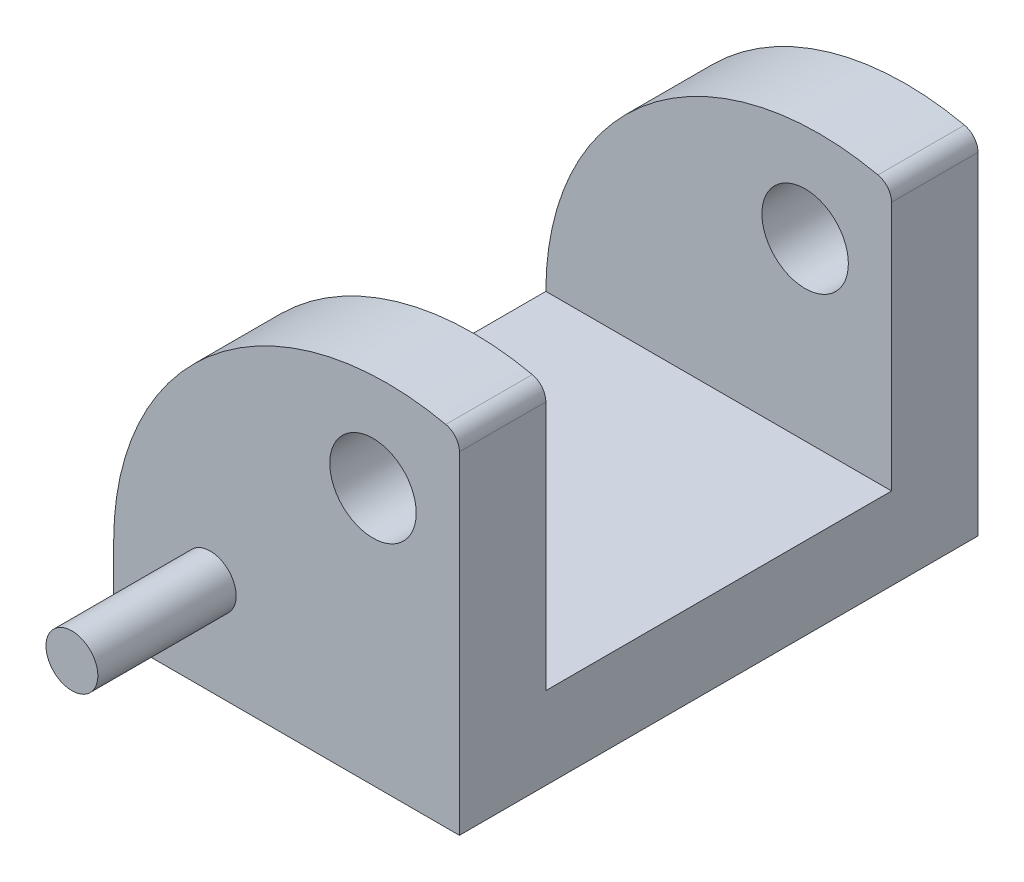
ISO-10303-21;
HEADER;
FILE_DESCRIPTION(('STEP AP214'),'2;1');
FILE_NAME('part.step','',(''),(''),'','','');
FILE_SCHEMA(('AUTOMOTIVE_DESIGN { 1 0 10303 214 1 1 1 1 }'));
ENDSEC;
DATA;
#1=APPLICATION_CONTEXT('core data for automotive mechanical design processes');
#2=APPLICATION_PROTOCOL_DEFINITION('international standard','automotive_design',2000,#1);
#3=PRODUCT_CONTEXT('',#1,'mechanical');
#4=PRODUCT('Part','Part','',(#3));
#5=PRODUCT_RELATED_PRODUCT_CATEGORY('part','',(#4));
#6=PRODUCT_DEFINITION_FORMATION('','',#4);
#7=PRODUCT_DEFINITION_CONTEXT('part definition',#1,'design');
#8=PRODUCT_DEFINITION('design','',#6,#7);
#9=PRODUCT_DEFINITION_SHAPE('','',#8);
#10=(LENGTH_UNIT() NAMED_UNIT(*) SI_UNIT(.MILLI.,.METRE.));
#11=(NAMED_UNIT(*) PLANE_ANGLE_UNIT() SI_UNIT($,.RADIAN.));
#12=(NAMED_UNIT(*) SI_UNIT($,.STERADIAN.) SOLID_ANGLE_UNIT());
#13=UNCERTAINTY_MEASURE_WITH_UNIT(LENGTH_MEASURE(1.E-05),#10,'distance_accuracy_value','');
#14=(GEOMETRIC_REPRESENTATION_CONTEXT(3) GLOBAL_UNCERTAINTY_ASSIGNED_CONTEXT((#13)) GLOBAL_UNIT_ASSIGNED_CONTEXT((#10,
#11,#12)) REPRESENTATION_CONTEXT('',''));
#15=CARTESIAN_POINT('',(0.,0.,0.));
#16=DIRECTION('',(0.,0.,1.));
#17=DIRECTION('',(1.,0.,0.));
#18=AXIS2_PLACEMENT_3D('',#15,#16,#17);
#19=CARTESIAN_POINT('',(32.6634557895005,0.,762.));
#20=DIRECTION('',(-1.,0.,0.));
#21=DIRECTION('',(0.,0.,1.));
#22=AXIS2_PLACEMENT_3D('',#19,#20,#21);
#23=PLANE('',#22);
#24=DIRECTION('',(0.,1.,0.));
#25=VECTOR('',#24,1.);
#26=CARTESIAN_POINT('',(32.6634557895005,0.,0.));
#27=LINE('',#26,#25);
#28=CARTESIAN_POINT('',(32.6634557895005,0.,0.));
#29=VERTEX_POINT('',#28);
#30=CARTESIAN_POINT('',(32.6634557895005,488.127047395427,0.));
#31=VERTEX_POINT('',#30);
#32=EDGE_CURVE('E173',#29,#31,#27,.T.);
#33=ORIENTED_EDGE('',*,*,#32,.T.);
#34=DIRECTION('',(0.,0.,-1.));
#35=VECTOR('',#34,1.);
#36=CARTESIAN_POINT('',(32.6634557895005,488.127047395427,762.));
#37=LINE('',#36,#35);
#38=CARTESIAN_POINT('',(32.6634557895005,488.127047395427,127.));
#39=VERTEX_POINT('',#38);
#40=EDGE_CURVE('E307',#31,#39,#37,.F.);
#41=ORIENTED_EDGE('',*,*,#40,.T.);
#42=DIRECTION('',(0.,1.,0.));
#43=VECTOR('',#42,1.);
#44=CARTESIAN_POINT('',(32.6634557895005,0.,127.));
#45=LINE('',#44,#43);
#46=CARTESIAN_POINT('',(32.6634557895005,120.739091765194,127.));
#47=VERTEX_POINT('',#46);
#48=EDGE_CURVE('E195',#47,#39,#45,.T.);
#49=ORIENTED_EDGE('',*,*,#48,.F.);
#50=DIRECTION('',(0.,0.,1.));
#51=VECTOR('',#50,1.);
#52=CARTESIAN_POINT('',(32.6634557895005,120.739091765194,762.));
#53=LINE('',#52,#51);
#54=CARTESIAN_POINT('',(32.6634557895005,120.739091765194,635.));
#55=VERTEX_POINT('',#54);
#56=EDGE_CURVE('E189',#47,#55,#53,.T.);
#57=ORIENTED_EDGE('',*,*,#56,.T.);
#58=DIRECTION('',(0.,1.,0.));
#59=VECTOR('',#58,1.);
#60=CARTESIAN_POINT('',(32.6634557895005,0.,635.));
#61=LINE('',#60,#59);
#62=CARTESIAN_POINT('',(32.6634557895005,488.127047395427,635.));
#63=VERTEX_POINT('',#62);
#64=EDGE_CURVE('E120',#55,#63,#61,.T.);
#65=ORIENTED_EDGE('',*,*,#64,.T.);
#66=DIRECTION('',(0.,0.,-1.));
#67=VECTOR('',#66,1.);
#68=CARTESIAN_POINT('',(32.6634557895005,488.127047395427,762.));
#69=LINE('',#68,#67);
#70=CARTESIAN_POINT('',(32.6634557895005,488.127047395427,762.));
#71=VERTEX_POINT('',#70);
#72=EDGE_CURVE('E304',#63,#71,#69,.F.);
#73=ORIENTED_EDGE('',*,*,#72,.T.);
#74=DIRECTION('',(0.,1.,0.));
#75=VECTOR('',#74,1.);
#76=CARTESIAN_POINT('',(32.6634557895005,0.,762.));
#77=LINE('',#76,#75);
#78=CARTESIAN_POINT('',(32.6634557895005,0.,762.));
#79=VERTEX_POINT('',#78);
#80=EDGE_CURVE('E159',#79,#71,#77,.T.);
#81=ORIENTED_EDGE('',*,*,#80,.F.);
#82=DIRECTION('',(0.,0.,-1.));
#83=VECTOR('',#82,1.);
#84=CARTESIAN_POINT('',(32.6634557895005,0.,762.));
#85=LINE('',#84,#83);
#86=EDGE_CURVE('E149',#79,#29,#85,.T.);
#87=ORIENTED_EDGE('',*,*,#86,.T.);
#88=EDGE_LOOP('',(#33,#41,#49,#57,#65,#73,#81,#87));
#89=FACE_BOUND('',#88,.T.);
#90=ADVANCED_FACE('F39',(#89),#23,.F.);
#91=CARTESIAN_POINT('',(-73.727281369115,120.739091765194,762.));
#92=DIRECTION('',(0.,0.,-1.));
#93=DIRECTION('',(-1.,0.,0.));
#94=AXIS2_PLACEMENT_3D('',#91,#92,#93);
#95=CYLINDRICAL_SURFACE('',#94,401.609262841385);
#96=CARTESIAN_POINT('',(-73.727281369115,120.739091765194,127.));
#97=DIRECTION('',(0.,0.,1.));
#98=DIRECTION('',(1.,0.,0.));
#99=AXIS2_PLACEMENT_3D('',#96,#97,#98);
#100=CIRCLE('',#99,401.609262841385);
#101=CARTESIAN_POINT('',(12.7315952720101,512.931471408087,127.));
#102=VERTEX_POINT('',#101);
#103=CARTESIAN_POINT('',(-475.3365442105,120.739091765194,127.));
#104=VERTEX_POINT('',#103);
#105=EDGE_CURVE('E199',#102,#104,#100,.T.);
#106=ORIENTED_EDGE('',*,*,#105,.F.);
#107=DIRECTION('',(0.,0.,-1.));
#108=VECTOR('',#107,1.);
#109=CARTESIAN_POINT('',(12.7315952720101,512.931471408087,762.));
#110=LINE('',#109,#108);
#111=CARTESIAN_POINT('',(12.7315952720101,512.931471408087,0.));
#112=VERTEX_POINT('',#111);
#113=EDGE_CURVE('E292',#102,#112,#110,.T.);
#114=ORIENTED_EDGE('',*,*,#113,.T.);
#115=CARTESIAN_POINT('',(-73.727281369115,120.739091765194,0.));
#116=DIRECTION('',(0.,0.,1.));
#117=DIRECTION('',(-1.,0.,0.));
#118=AXIS2_PLACEMENT_3D('',#115,#116,#117);
#119=CIRCLE('',#118,401.609262841385);
#120=CARTESIAN_POINT('',(-475.3365442105,120.739091765194,0.));
#121=VERTEX_POINT('',#120);
#122=EDGE_CURVE('E176',#112,#121,#119,.T.);
#123=ORIENTED_EDGE('',*,*,#122,.T.);
#124=DIRECTION('',(0.,0.,-1.));
#125=VECTOR('',#124,1.);
#126=CARTESIAN_POINT('',(-475.3365442105,120.739091765194,762.));
#127=LINE('',#126,#125);
#128=EDGE_CURVE('E137',#104,#121,#127,.T.);
#129=ORIENTED_EDGE('',*,*,#128,.F.);
#130=EDGE_LOOP('',(#106,#114,#123,#129));
#131=FACE_BOUND('',#130,.T.);
#132=ADVANCED_FACE('F231',(#131),#95,.T.);
#133=CARTESIAN_POINT('',(-73.727281369115,120.739091765194,762.));
#134=DIRECTION('',(0.,0.,1.));
#135=DIRECTION('',(-1.,0.,0.));
#136=AXIS2_PLACEMENT_3D('',#133,#134,#135);
#137=CIRCLE('',#136,401.609262841385);
#138=CARTESIAN_POINT('',(12.7315952720101,512.931471408087,762.));
#139=VERTEX_POINT('',#138);
#140=CARTESIAN_POINT('',(-475.3365442105,120.739091765194,762.));
#141=VERTEX_POINT('',#140);
#142=EDGE_CURVE('E156',#139,#141,#137,.T.);
#143=ORIENTED_EDGE('',*,*,#142,.F.);
#144=DIRECTION('',(0.,0.,-1.));
#145=VECTOR('',#144,1.);
#146=CARTESIAN_POINT('',(12.7315952720101,512.931471408087,762.));
#147=LINE('',#146,#145);
#148=CARTESIAN_POINT('',(12.7315952720101,512.931471408087,635.));
#149=VERTEX_POINT('',#148);
#150=EDGE_CURVE('E116',#139,#149,#147,.T.);
#151=ORIENTED_EDGE('',*,*,#150,.T.);
#152=CARTESIAN_POINT('',(-73.727281369115,120.739091765194,635.));
#153=DIRECTION('',(0.,0.,1.));
#154=DIRECTION('',(1.,0.,0.));
#155=AXIS2_PLACEMENT_3D('',#152,#153,#154);
#156=CIRCLE('',#155,401.609262841385);
#157=CARTESIAN_POINT('',(-475.3365442105,120.739091765194,635.));
#158=VERTEX_POINT('',#157);
#159=EDGE_CURVE('E110',#149,#158,#156,.T.);
#160=ORIENTED_EDGE('',*,*,#159,.T.);
#161=EDGE_CURVE('E114',#141,#158,#127,.T.);
#162=ORIENTED_EDGE('',*,*,#161,.F.);
#163=EDGE_LOOP('',(#143,#151,#160,#162));
#164=FACE_BOUND('',#163,.T.);
#165=ADVANCED_FACE('F112',(#164),#95,.T.);
#166=CARTESIAN_POINT('',(-94.3365442104993,378.291313638696,762.));
#167=DIRECTION('',(0.,0.,-1.));
#168=DIRECTION('',(-1.,0.,0.));
#169=AXIS2_PLACEMENT_3D('',#166,#167,#168);
#170=CYLINDRICAL_SURFACE('',#169,63.5);
#171=CARTESIAN_POINT('',(-94.3365442104993,378.291313638696,0.));
#172=DIRECTION('',(0.,0.,1.));
#173=DIRECTION('',(1.,0.,0.));
#174=AXIS2_PLACEMENT_3D('',#171,#172,#173);
#175=CIRCLE('',#174,63.5);
#176=CARTESIAN_POINT('',(-30.8365442104993,378.291313638696,0.));
#177=VERTEX_POINT('',#176);
#178=EDGE_CURVE('E185',#177,#177,#175,.T.);
#179=ORIENTED_EDGE('',*,*,#178,.F.);
#180=EDGE_LOOP('',(#179));
#181=FACE_BOUND('',#180,.T.);
#182=CARTESIAN_POINT('',(-94.3365442104993,378.291313638696,127.));
#183=DIRECTION('',(0.,0.,1.));
#184=DIRECTION('',(1.,0.,0.));
#185=AXIS2_PLACEMENT_3D('',#182,#183,#184);
#186=CIRCLE('',#185,63.5);
#187=CARTESIAN_POINT('',(-30.8365442104993,378.291313638696,127.));
#188=VERTEX_POINT('',#187);
#189=EDGE_CURVE('E202',#188,#188,#186,.T.);
#190=ORIENTED_EDGE('',*,*,#189,.T.);
#191=EDGE_LOOP('',(#190));
#192=FACE_BOUND('',#191,.T.);
#193=ADVANCED_FACE('F255',(#181,#192),#170,.F.);
#194=CARTESIAN_POINT('',(-73.727281369115,120.739091765194,762.));
#195=DIRECTION('',(0.,0.,-1.));
#196=DIRECTION('',(-1.,0.,0.));
#197=AXIS2_PLACEMENT_3D('',#194,#195,#196);
#198=PLANE('',#197);
#199=CARTESIAN_POINT('',(-333.507660116275,140.616973840815,762.));
#200=DIRECTION('',(0.,0.,-1.));
#201=DIRECTION('',(-1.,0.,0.));
#202=AXIS2_PLACEMENT_3D('',#199,#200,#201);
#203=CIRCLE('',#202,38.1);
#204=CARTESIAN_POINT('',(-371.607660116275,140.616973840815,762.));
#205=VERTEX_POINT('',#204);
#206=EDGE_CURVE('E285',#205,#205,#203,.F.);
#207=ORIENTED_EDGE('',*,*,#206,.F.);
#208=EDGE_LOOP('',(#207));
#209=FACE_BOUND('',#208,.T.);
#210=ORIENTED_EDGE('',*,*,#80,.T.);
#211=CARTESIAN_POINT('',(7.26345578950047,488.127047395427,762.));
#212=DIRECTION('',(0.,0.,-1.));
#213=DIRECTION('',(-1.,0.,0.));
#214=AXIS2_PLACEMENT_3D('',#211,#212,#213);
#215=CIRCLE('',#214,25.4);
#216=EDGE_CURVE('E11',#71,#139,#215,.F.);
#217=ORIENTED_EDGE('',*,*,#216,.T.);
#218=ORIENTED_EDGE('',*,*,#142,.T.);
#219=DIRECTION('',(0.,-1.,0.));
#220=VECTOR('',#219,1.);
#221=CARTESIAN_POINT('',(-475.3365442105,0.,762.));
#222=LINE('',#221,#220);
#223=CARTESIAN_POINT('',(-475.3365442105,0.,762.));
#224=VERTEX_POINT('',#223);
#225=EDGE_CURVE('E147',#141,#224,#222,.T.);
#226=ORIENTED_EDGE('',*,*,#225,.T.);
#227=DIRECTION('',(1.,0.,0.));
#228=VECTOR('',#227,1.);
#229=CARTESIAN_POINT('',(-475.3365442105,0.,762.));
#230=LINE('',#229,#228);
#231=EDGE_CURVE('E162',#224,#79,#230,.T.);
#232=ORIENTED_EDGE('',*,*,#231,.T.);
#233=EDGE_LOOP('',(#210,#217,#218,#226,#232));
#234=FACE_BOUND('',#233,.T.);
#235=CARTESIAN_POINT('',(-94.3365442104993,378.291313638696,762.));
#236=DIRECTION('',(0.,0.,1.));
#237=DIRECTION('',(1.,0.,0.));
#238=AXIS2_PLACEMENT_3D('',#235,#236,#237);
#239=CIRCLE('',#238,63.5);
#240=CARTESIAN_POINT('',(-30.8365442104993,378.291313638696,762.));
#241=VERTEX_POINT('',#240);
#242=EDGE_CURVE('E170',#241,#241,#239,.T.);
#243=ORIENTED_EDGE('',*,*,#242,.F.);
#244=EDGE_LOOP('',(#243));
#245=FACE_BOUND('',#244,.T.);
#246=ADVANCED_FACE('F250',(#209,#234,#245),#198,.F.);
#247=CARTESIAN_POINT('',(-73.727281369115,120.739091765194,0.));
#248=DIRECTION('',(0.,0.,-1.));
#249=DIRECTION('',(-1.,0.,0.));
#250=AXIS2_PLACEMENT_3D('',#247,#248,#249);
#251=PLANE('',#250);
#252=CARTESIAN_POINT('',(-333.507660116275,140.616973840815,0.));
#253=DIRECTION('',(0.,0.,-1.));
#254=DIRECTION('',(-1.,0.,0.));
#255=AXIS2_PLACEMENT_3D('',#252,#253,#254);
#256=CIRCLE('',#255,38.1);
#257=CARTESIAN_POINT('',(-371.607660116275,140.616973840815,0.));
#258=VERTEX_POINT('',#257);
#259=EDGE_CURVE('E287',#258,#258,#256,.T.);
#260=ORIENTED_EDGE('',*,*,#259,.F.);
#261=EDGE_LOOP('',(#260));
#262=FACE_BOUND('',#261,.T.);
#263=ORIENTED_EDGE('',*,*,#122,.F.);
#264=CARTESIAN_POINT('',(7.26345578950047,488.127047395427,0.));
#265=DIRECTION('',(0.,0.,-1.));
#266=DIRECTION('',(-1.,0.,0.));
#267=AXIS2_PLACEMENT_3D('',#264,#265,#266);
#268=CIRCLE('',#267,25.4);
#269=EDGE_CURVE('E301',#112,#31,#268,.T.);
#270=ORIENTED_EDGE('',*,*,#269,.T.);
#271=ORIENTED_EDGE('',*,*,#32,.F.);
#272=DIRECTION('',(1.,0.,0.));
#273=VECTOR('',#272,1.);
#274=CARTESIAN_POINT('',(-475.3365442105,0.,0.));
#275=LINE('',#274,#273);
#276=CARTESIAN_POINT('',(-475.3365442105,0.,0.));
#277=VERTEX_POINT('',#276);
#278=EDGE_CURVE('E169',#277,#29,#275,.T.);
#279=ORIENTED_EDGE('',*,*,#278,.F.);
#280=DIRECTION('',(0.,-1.,0.));
#281=VECTOR('',#280,1.);
#282=CARTESIAN_POINT('',(-475.3365442105,0.,0.));
#283=LINE('',#282,#281);
#284=EDGE_CURVE('E166',#121,#277,#283,.T.);
#285=ORIENTED_EDGE('',*,*,#284,.F.);
#286=EDGE_LOOP('',(#263,#270,#271,#279,#285));
#287=FACE_BOUND('',#286,.T.);
#288=ORIENTED_EDGE('',*,*,#178,.T.);
#289=EDGE_LOOP('',(#288));
#290=FACE_BOUND('',#289,.T.);
#291=ADVANCED_FACE('F246',(#262,#287,#290),#251,.T.);
#292=CARTESIAN_POINT('',(-475.3365442105,0.,762.));
#293=DIRECTION('',(1.,0.,0.));
#294=DIRECTION('',(0.,0.,-1.));
#295=AXIS2_PLACEMENT_3D('',#292,#293,#294);
#296=PLANE('',#295);
#297=ORIENTED_EDGE('',*,*,#284,.T.);
#298=DIRECTION('',(0.,0.,-1.));
#299=VECTOR('',#298,1.);
#300=CARTESIAN_POINT('',(-475.3365442105,0.,762.));
#301=LINE('',#300,#299);
#302=EDGE_CURVE('E152',#224,#277,#301,.T.);
#303=ORIENTED_EDGE('',*,*,#302,.F.);
#304=ORIENTED_EDGE('',*,*,#225,.F.);
#305=ORIENTED_EDGE('',*,*,#161,.T.);
#306=EDGE_CURVE('E127',#158,#104,#127,.T.);
#307=ORIENTED_EDGE('',*,*,#306,.T.);
#308=ORIENTED_EDGE('',*,*,#128,.T.);
#309=EDGE_LOOP('',(#297,#303,#304,#305,#307,#308));
#310=FACE_BOUND('',#309,.T.);
#311=ADVANCED_FACE('F144',(#310),#296,.F.);
#312=CARTESIAN_POINT('',(-475.3365442105,0.,762.));
#313=DIRECTION('',(0.,1.,0.));
#314=DIRECTION('',(0.,0.,1.));
#315=AXIS2_PLACEMENT_3D('',#312,#313,#314);
#316=PLANE('',#315);
#317=ORIENTED_EDGE('',*,*,#278,.T.);
#318=ORIENTED_EDGE('',*,*,#86,.F.);
#319=ORIENTED_EDGE('',*,*,#231,.F.);
#320=ORIENTED_EDGE('',*,*,#302,.T.);
#321=EDGE_LOOP('',(#317,#318,#319,#320));
#322=FACE_BOUND('',#321,.T.);
#323=ADVANCED_FACE('F240',(#322),#316,.F.);
#324=CARTESIAN_POINT('',(-94.3365442104993,378.291313638696,635.));
#325=DIRECTION('',(0.,0.,1.));
#326=DIRECTION('',(1.,0.,0.));
#327=AXIS2_PLACEMENT_3D('',#324,#325,#326);
#328=CIRCLE('',#327,63.5);
#329=CARTESIAN_POINT('',(-30.8365442104993,378.291313638696,635.));
#330=VERTEX_POINT('',#329);
#331=EDGE_CURVE('E121',#330,#330,#328,.T.);
#332=ORIENTED_EDGE('',*,*,#331,.F.);
#333=EDGE_LOOP('',(#332));
#334=FACE_BOUND('',#333,.T.);
#335=ORIENTED_EDGE('',*,*,#242,.T.);
#336=EDGE_LOOP('',(#335));
#337=FACE_BOUND('',#336,.T.);
#338=ADVANCED_FACE('F243',(#334,#337),#170,.F.);
#339=CARTESIAN_POINT('',(0.,120.739091765194,0.));
#340=DIRECTION('',(0.,-1.,0.));
#341=DIRECTION('',(0.,0.,-1.));
#342=AXIS2_PLACEMENT_3D('',#339,#340,#341);
#343=PLANE('',#342);
#344=DIRECTION('',(1.,0.,0.));
#345=VECTOR('',#344,1.);
#346=CARTESIAN_POINT('',(-556.047596723986,120.739091765194,127.));
#347=LINE('',#346,#345);
#348=EDGE_CURVE('E132',#104,#47,#347,.T.);
#349=ORIENTED_EDGE('',*,*,#348,.F.);
#350=ORIENTED_EDGE('',*,*,#306,.F.);
#351=DIRECTION('',(1.,0.,0.));
#352=VECTOR('',#351,1.);
#353=CARTESIAN_POINT('',(-556.047596723986,120.739091765194,635.));
#354=LINE('',#353,#352);
#355=EDGE_CURVE('E129',#158,#55,#354,.T.);
#356=ORIENTED_EDGE('',*,*,#355,.T.);
#357=ORIENTED_EDGE('',*,*,#56,.F.);
#358=EDGE_LOOP('',(#349,#350,#356,#357));
#359=FACE_BOUND('',#358,.T.);
#360=ADVANCED_FACE('F128',(#359),#343,.F.);
#361=CARTESIAN_POINT('',(-556.047596723986,120.739091765194,127.));
#362=DIRECTION('',(0.,0.,1.));
#363=DIRECTION('',(1.,0.,0.));
#364=AXIS2_PLACEMENT_3D('',#361,#362,#363);
#365=PLANE('',#364);
#366=ORIENTED_EDGE('',*,*,#189,.F.);
#367=EDGE_LOOP('',(#366));
#368=FACE_BOUND('',#367,.T.);
#369=ORIENTED_EDGE('',*,*,#48,.T.);
#370=CARTESIAN_POINT('',(7.26345578950047,488.127047395427,127.));
#371=DIRECTION('',(0.,0.,1.));
#372=DIRECTION('',(1.,0.,0.));
#373=AXIS2_PLACEMENT_3D('',#370,#371,#372);
#374=CIRCLE('',#373,25.4);
#375=EDGE_CURVE('E310',#39,#102,#374,.T.);
#376=ORIENTED_EDGE('',*,*,#375,.T.);
#377=ORIENTED_EDGE('',*,*,#105,.T.);
#378=ORIENTED_EDGE('',*,*,#348,.T.);
#379=EDGE_LOOP('',(#369,#376,#377,#378));
#380=FACE_BOUND('',#379,.T.);
#381=ADVANCED_FACE('F264',(#368,#380),#365,.T.);
#382=CARTESIAN_POINT('',(-556.047596723986,120.739091765194,635.));
#383=DIRECTION('',(0.,0.,1.));
#384=DIRECTION('',(1.,0.,0.));
#385=AXIS2_PLACEMENT_3D('',#382,#383,#384);
#386=PLANE('',#385);
#387=ORIENTED_EDGE('',*,*,#331,.T.);
#388=EDGE_LOOP('',(#387));
#389=FACE_BOUND('',#388,.T.);
#390=ORIENTED_EDGE('',*,*,#159,.F.);
#391=CARTESIAN_POINT('',(7.26345578950047,488.127047395427,635.));
#392=DIRECTION('',(0.,0.,1.));
#393=DIRECTION('',(1.,0.,0.));
#394=AXIS2_PLACEMENT_3D('',#391,#392,#393);
#395=CIRCLE('',#394,25.4);
#396=EDGE_CURVE('E48',#149,#63,#395,.F.);
#397=ORIENTED_EDGE('',*,*,#396,.T.);
#398=ORIENTED_EDGE('',*,*,#64,.F.);
#399=ORIENTED_EDGE('',*,*,#355,.F.);
#400=EDGE_LOOP('',(#390,#397,#398,#399));
#401=FACE_BOUND('',#400,.T.);
#402=ADVANCED_FACE('F139',(#389,#401),#386,.F.);
#403=CARTESIAN_POINT('',(-333.507660116275,140.616973840815,965.2));
#404=DIRECTION('',(0.,0.,-1.));
#405=DIRECTION('',(-1.,0.,0.));
#406=AXIS2_PLACEMENT_3D('',#403,#404,#405);
#407=CYLINDRICAL_SURFACE('',#406,38.1);
#408=CARTESIAN_POINT('',(-333.507660116275,140.616973840815,965.2));
#409=DIRECTION('',(0.,0.,1.));
#410=DIRECTION('',(1.,0.,0.));
#411=AXIS2_PLACEMENT_3D('',#408,#409,#410);
#412=CIRCLE('',#411,38.1);
#413=CARTESIAN_POINT('',(-295.407660116275,140.616973840815,965.2));
#414=VERTEX_POINT('',#413);
#415=EDGE_CURVE('E207',#414,#414,#412,.T.);
#416=ORIENTED_EDGE('',*,*,#415,.F.);
#417=EDGE_LOOP('',(#416));
#418=FACE_BOUND('',#417,.T.);
#419=ORIENTED_EDGE('',*,*,#206,.T.);
#420=EDGE_LOOP('',(#419));
#421=FACE_BOUND('',#420,.T.);
#422=ADVANCED_FACE('F270',(#418,#421),#407,.T.);
#423=CARTESIAN_POINT('',(-333.507660116275,140.616973840815,965.2));
#424=DIRECTION('',(0.,0.,1.));
#425=DIRECTION('',(1.,0.,0.));
#426=AXIS2_PLACEMENT_3D('',#423,#424,#425);
#427=PLANE('',#426);
#428=ORIENTED_EDGE('',*,*,#415,.T.);
#429=EDGE_LOOP('',(#428));
#430=FACE_BOUND('',#429,.T.);
#431=ADVANCED_FACE('F228',(#430),#427,.T.);
#432=CARTESIAN_POINT('',(-333.507660116275,140.616973840815,-203.2));
#433=DIRECTION('',(0.,0.,1.));
#434=DIRECTION('',(1.,0.,0.));
#435=AXIS2_PLACEMENT_3D('',#432,#433,#434);
#436=CYLINDRICAL_SURFACE('',#435,38.1);
#437=CARTESIAN_POINT('',(-333.507660116275,140.616973840815,-203.2));
#438=DIRECTION('',(0.,0.,1.));
#439=DIRECTION('',(1.,0.,0.));
#440=AXIS2_PLACEMENT_3D('',#437,#438,#439);
#441=CIRCLE('',#440,38.1);
#442=CARTESIAN_POINT('',(-295.407660116275,140.616973840815,-203.2));
#443=VERTEX_POINT('',#442);
#444=EDGE_CURVE('E211',#443,#443,#441,.T.);
#445=ORIENTED_EDGE('',*,*,#444,.T.);
#446=EDGE_LOOP('',(#445));
#447=FACE_BOUND('',#446,.T.);
#448=ORIENTED_EDGE('',*,*,#259,.T.);
#449=EDGE_LOOP('',(#448));
#450=FACE_BOUND('',#449,.T.);
#451=ADVANCED_FACE('F216',(#447,#450),#436,.T.);
#452=CARTESIAN_POINT('',(-333.507660116275,140.616973840815,-203.2));
#453=DIRECTION('',(0.,0.,-1.));
#454=DIRECTION('',(1.,0.,0.));
#455=AXIS2_PLACEMENT_3D('',#452,#453,#454);
#456=PLANE('',#455);
#457=ORIENTED_EDGE('',*,*,#444,.F.);
#458=EDGE_LOOP('',(#457));
#459=FACE_BOUND('',#458,.T.);
#460=ADVANCED_FACE('F219',(#459),#456,.T.);
#461=CARTESIAN_POINT('',(7.26345578950047,488.127047395427,762.));
#462=DIRECTION('',(0.,0.,-1.));
#463=DIRECTION('',(-1.,0.,0.));
#464=AXIS2_PLACEMENT_3D('',#461,#462,#463);
#465=CYLINDRICAL_SURFACE('',#464,25.4);
#466=ORIENTED_EDGE('',*,*,#375,.F.);
#467=ORIENTED_EDGE('',*,*,#40,.F.);
#468=ORIENTED_EDGE('',*,*,#269,.F.);
#469=ORIENTED_EDGE('',*,*,#113,.F.);
#470=EDGE_LOOP('',(#466,#467,#468,#469));
#471=FACE_BOUND('',#470,.T.);
#472=ADVANCED_FACE('F221',(#471),#465,.T.);
#473=CARTESIAN_POINT('',(7.26345578950047,488.127047395427,762.));
#474=DIRECTION('',(0.,0.,-1.));
#475=DIRECTION('',(-1.,0.,0.));
#476=AXIS2_PLACEMENT_3D('',#473,#474,#475);
#477=CYLINDRICAL_SURFACE('',#476,25.4);
#478=ORIENTED_EDGE('',*,*,#216,.F.);
#479=ORIENTED_EDGE('',*,*,#72,.F.);
#480=ORIENTED_EDGE('',*,*,#396,.F.);
#481=ORIENTED_EDGE('',*,*,#150,.F.);
#482=EDGE_LOOP('',(#478,#479,#480,#481));
#483=FACE_BOUND('',#482,.T.);
#484=ADVANCED_FACE('F41',(#483),#477,.T.);
#485=CLOSED_SHELL('',(#90,#132,#165,#193,#246,#291,#311,#323,#338,#360,#381,#402,#422,#431,#451,
#460,#472,#484));
#486=MANIFOLD_SOLID_BREP('B2',#485);
#487=ADVANCED_BREP_SHAPE_REPRESENTATION('',(#18,#486),#14);
#488=SHAPE_DEFINITION_REPRESENTATION(#9,#487);
ENDSEC;
END-ISO-10303-21;
